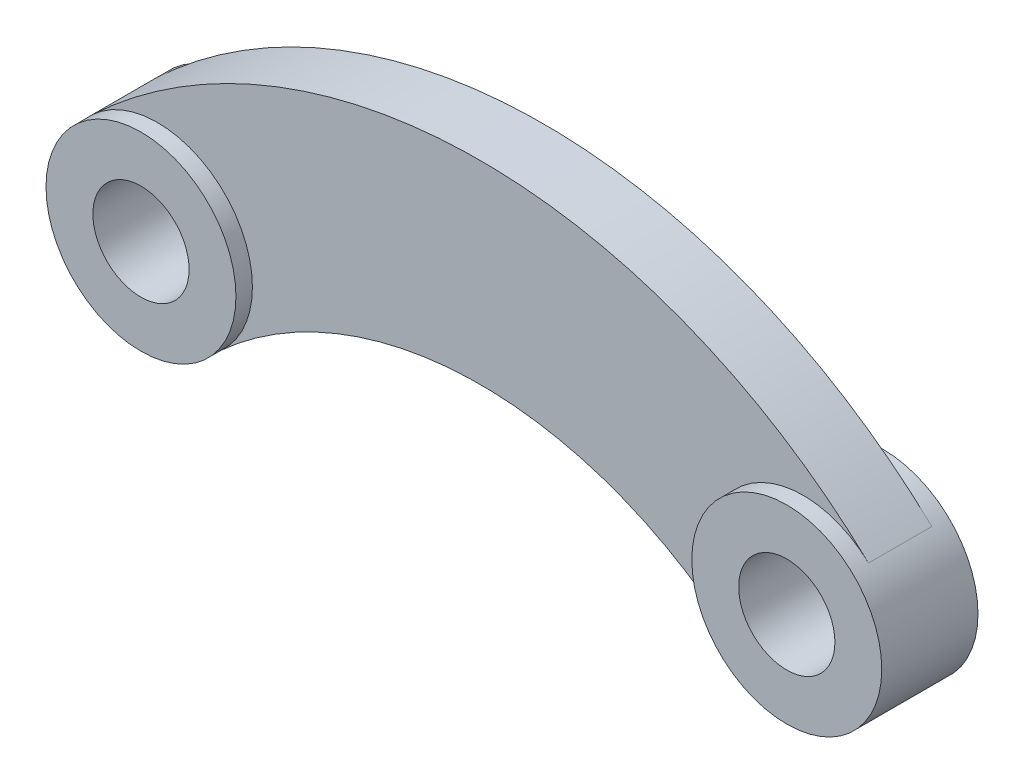
ISO-10303-21;
HEADER;
FILE_DESCRIPTION(('STEP AP214'),'2;1');
FILE_NAME('part.step','',(''),(''),'','','');
FILE_SCHEMA(('AUTOMOTIVE_DESIGN { 1 0 10303 214 1 1 1 1 }'));
ENDSEC;
DATA;
#1=APPLICATION_CONTEXT('core data for automotive mechanical design processes');
#2=APPLICATION_PROTOCOL_DEFINITION('international standard','automotive_design',2000,#1);
#3=PRODUCT_CONTEXT('',#1,'mechanical');
#4=PRODUCT('Part','Part','',(#3));
#5=PRODUCT_RELATED_PRODUCT_CATEGORY('part','',(#4));
#6=PRODUCT_DEFINITION_FORMATION('','',#4);
#7=PRODUCT_DEFINITION_CONTEXT('part definition',#1,'design');
#8=PRODUCT_DEFINITION('design','',#6,#7);
#9=PRODUCT_DEFINITION_SHAPE('','',#8);
#10=(LENGTH_UNIT() NAMED_UNIT(*) SI_UNIT(.MILLI.,.METRE.));
#11=(NAMED_UNIT(*) PLANE_ANGLE_UNIT() SI_UNIT($,.RADIAN.));
#12=(NAMED_UNIT(*) SI_UNIT($,.STERADIAN.) SOLID_ANGLE_UNIT());
#13=UNCERTAINTY_MEASURE_WITH_UNIT(LENGTH_MEASURE(1.E-05),#10,'distance_accuracy_value','');
#14=(GEOMETRIC_REPRESENTATION_CONTEXT(3) GLOBAL_UNCERTAINTY_ASSIGNED_CONTEXT((#13)) GLOBAL_UNIT_ASSIGNED_CONTEXT((#10,
#11,#12)) REPRESENTATION_CONTEXT('',''));
#15=CARTESIAN_POINT('',(0.,0.,0.));
#16=DIRECTION('',(0.,0.,1.));
#17=DIRECTION('',(1.,0.,0.));
#18=AXIS2_PLACEMENT_3D('',#15,#16,#17);
#19=CARTESIAN_POINT('',(382.5,-140.867845869808,25.));
#20=DIRECTION('',(0.,0.,-1.));
#21=DIRECTION('',(-1.,0.,0.));
#22=AXIS2_PLACEMENT_3D('',#19,#20,#21);
#23=PLANE('',#22);
#24=CARTESIAN_POINT('',(510.,0.,25.));
#25=DIRECTION('',(0.,0.,-1.));
#26=DIRECTION('',(-1.,0.,0.));
#27=AXIS2_PLACEMENT_3D('',#24,#25,#26);
#28=CIRCLE('',#27,75.0000000000001);
#29=CARTESIAN_POINT('',(561.549865229111,54.4757872348858,25.));
#30=VERTEX_POINT('',#29);
#31=CARTESIAN_POINT('',(459.671052631579,-55.6057286328191,25.));
#32=VERTEX_POINT('',#31);
#33=EDGE_CURVE('E96',#30,#32,#28,.F.);
#34=ORIENTED_EDGE('',*,*,#33,.F.);
#35=CARTESIAN_POINT('',(255.,-269.473560855235,25.));
#36=DIRECTION('',(0.,0.,1.));
#37=DIRECTION('',(-1.,0.,0.));
#38=AXIS2_PLACEMENT_3D('',#35,#36,#37);
#39=CIRCLE('',#38,446.);
#40=CARTESIAN_POINT('',(-51.5498652291105,54.4757872348858,25.));
#41=VERTEX_POINT('',#40);
#42=EDGE_CURVE('E61',#30,#41,#39,.T.);
#43=ORIENTED_EDGE('',*,*,#42,.T.);
#44=CARTESIAN_POINT('',(0.,0.,25.));
#45=DIRECTION('',(0.,0.,-1.));
#46=DIRECTION('',(-1.,0.,0.));
#47=AXIS2_PLACEMENT_3D('',#44,#45,#46);
#48=CIRCLE('',#47,75.0000000000001);
#49=CARTESIAN_POINT('',(50.3289473684211,-55.605728632819,25.));
#50=VERTEX_POINT('',#49);
#51=EDGE_CURVE('E114',#50,#41,#48,.F.);
#52=ORIENTED_EDGE('',*,*,#51,.F.);
#53=CARTESIAN_POINT('',(255.,-281.735691739616,25.));
#54=DIRECTION('',(0.,0.,-1.));
#55=DIRECTION('',(-1.,0.,0.));
#56=AXIS2_PLACEMENT_3D('',#53,#54,#55);
#57=CIRCLE('',#56,305.);
#58=EDGE_CURVE('E80',#50,#32,#57,.T.);
#59=ORIENTED_EDGE('',*,*,#58,.T.);
#60=EDGE_LOOP('',(#34,#43,#52,#59));
#61=FACE_BOUND('',#60,.T.);
#62=ADVANCED_FACE('F43',(#61),#23,.F.);
#63=CARTESIAN_POINT('',(382.5,-140.867845869808,-25.));
#64=DIRECTION('',(0.,0.,-1.));
#65=DIRECTION('',(-1.,0.,0.));
#66=AXIS2_PLACEMENT_3D('',#63,#64,#65);
#67=PLANE('',#66);
#68=CARTESIAN_POINT('',(255.,-269.473560855235,-25.));
#69=DIRECTION('',(0.,0.,1.));
#70=DIRECTION('',(-1.,0.,0.));
#71=AXIS2_PLACEMENT_3D('',#68,#69,#70);
#72=CIRCLE('',#71,446.);
#73=CARTESIAN_POINT('',(561.549865229111,54.4757872348858,-25.));
#74=VERTEX_POINT('',#73);
#75=CARTESIAN_POINT('',(-51.5498652291105,54.4757872348858,-25.));
#76=VERTEX_POINT('',#75);
#77=EDGE_CURVE('E102',#74,#76,#72,.T.);
#78=ORIENTED_EDGE('',*,*,#77,.F.);
#79=CARTESIAN_POINT('',(510.,0.,-25.));
#80=DIRECTION('',(0.,0.,-1.));
#81=DIRECTION('',(-1.,0.,0.));
#82=AXIS2_PLACEMENT_3D('',#79,#80,#81);
#83=CIRCLE('',#82,75.0000000000001);
#84=CARTESIAN_POINT('',(459.671052631579,-55.605728632819,-25.));
#85=VERTEX_POINT('',#84);
#86=EDGE_CURVE('E72',#74,#85,#83,.F.);
#87=ORIENTED_EDGE('',*,*,#86,.T.);
#88=CARTESIAN_POINT('',(255.,-281.735691739616,-25.));
#89=DIRECTION('',(0.,0.,-1.));
#90=DIRECTION('',(-1.,0.,0.));
#91=AXIS2_PLACEMENT_3D('',#88,#89,#90);
#92=CIRCLE('',#91,305.);
#93=CARTESIAN_POINT('',(50.3289473684211,-55.605728632819,-25.));
#94=VERTEX_POINT('',#93);
#95=EDGE_CURVE('E109',#94,#85,#92,.T.);
#96=ORIENTED_EDGE('',*,*,#95,.F.);
#97=CARTESIAN_POINT('',(0.,0.,-25.));
#98=DIRECTION('',(0.,0.,-1.));
#99=DIRECTION('',(-1.,0.,0.));
#100=AXIS2_PLACEMENT_3D('',#97,#98,#99);
#101=CIRCLE('',#100,75.0000000000001);
#102=EDGE_CURVE('E107',#94,#76,#101,.F.);
#103=ORIENTED_EDGE('',*,*,#102,.T.);
#104=EDGE_LOOP('',(#78,#87,#96,#103));
#105=FACE_BOUND('',#104,.T.);
#106=ADVANCED_FACE('F106',(#105),#67,.T.);
#107=CARTESIAN_POINT('',(255.,-281.735691739616,25.));
#108=DIRECTION('',(0.,0.,-1.));
#109=DIRECTION('',(-1.,0.,0.));
#110=AXIS2_PLACEMENT_3D('',#107,#108,#109);
#111=CYLINDRICAL_SURFACE('',#110,305.);
#112=ORIENTED_EDGE('',*,*,#95,.T.);
#113=DIRECTION('',(0.,0.,-1.));
#114=VECTOR('',#113,1.);
#115=CARTESIAN_POINT('',(459.671052631579,-55.605728632819,25.));
#116=LINE('',#115,#114);
#117=EDGE_CURVE('E11',#32,#85,#116,.T.);
#118=ORIENTED_EDGE('',*,*,#117,.F.);
#119=ORIENTED_EDGE('',*,*,#58,.F.);
#120=DIRECTION('',(0.,0.,-1.));
#121=VECTOR('',#120,1.);
#122=CARTESIAN_POINT('',(50.3289473684211,-55.605728632819,25.));
#123=LINE('',#122,#121);
#124=EDGE_CURVE('E118',#50,#94,#123,.T.);
#125=ORIENTED_EDGE('',*,*,#124,.T.);
#126=EDGE_LOOP('',(#112,#118,#119,#125));
#127=FACE_BOUND('',#126,.T.);
#128=ADVANCED_FACE('F45',(#127),#111,.F.);
#129=CARTESIAN_POINT('',(510.,0.,25.));
#130=DIRECTION('',(0.,0.,-1.));
#131=DIRECTION('',(-1.,0.,0.));
#132=AXIS2_PLACEMENT_3D('',#129,#130,#131);
#133=CYLINDRICAL_SURFACE('',#132,75.0000000000001);
#134=ORIENTED_EDGE('',*,*,#117,.T.);
#135=ORIENTED_EDGE('',*,*,#86,.F.);
#136=DIRECTION('',(0.,0.,-1.));
#137=VECTOR('',#136,1.);
#138=CARTESIAN_POINT('',(561.549865229111,54.4757872348858,25.));
#139=LINE('',#138,#137);
#140=EDGE_CURVE('E53',#30,#74,#139,.T.);
#141=ORIENTED_EDGE('',*,*,#140,.F.);
#142=ORIENTED_EDGE('',*,*,#33,.T.);
#143=EDGE_LOOP('',(#134,#135,#141,#142));
#144=FACE_BOUND('',#143,.T.);
#145=CARTESIAN_POINT('',(510.,0.,-38.));
#146=DIRECTION('',(0.,0.,1.));
#147=DIRECTION('',(1.,0.,0.));
#148=AXIS2_PLACEMENT_3D('',#145,#146,#147);
#149=CIRCLE('',#148,75.0000000000001);
#150=CARTESIAN_POINT('',(585.,0.,-38.));
#151=VERTEX_POINT('',#150);
#152=EDGE_CURVE('E154',#151,#151,#149,.T.);
#153=ORIENTED_EDGE('',*,*,#152,.T.);
#154=EDGE_LOOP('',(#153));
#155=FACE_BOUND('',#154,.T.);
#156=CARTESIAN_POINT('',(510.,0.,38.));
#157=DIRECTION('',(0.,0.,1.));
#158=DIRECTION('',(1.,0.,0.));
#159=AXIS2_PLACEMENT_3D('',#156,#157,#158);
#160=CIRCLE('',#159,75.0000000000001);
#161=CARTESIAN_POINT('',(585.,0.,38.));
#162=VERTEX_POINT('',#161);
#163=EDGE_CURVE('E158',#162,#162,#160,.T.);
#164=ORIENTED_EDGE('',*,*,#163,.F.);
#165=EDGE_LOOP('',(#164));
#166=FACE_BOUND('',#165,.T.);
#167=ADVANCED_FACE('F91',(#144,#155,#166),#133,.T.);
#168=CARTESIAN_POINT('',(255.,-269.473560855235,25.));
#169=DIRECTION('',(0.,0.,-1.));
#170=DIRECTION('',(-1.,0.,0.));
#171=AXIS2_PLACEMENT_3D('',#168,#169,#170);
#172=CYLINDRICAL_SURFACE('',#171,446.);
#173=ORIENTED_EDGE('',*,*,#77,.T.);
#174=DIRECTION('',(0.,0.,-1.));
#175=VECTOR('',#174,1.);
#176=CARTESIAN_POINT('',(-51.5498652291105,54.4757872348858,25.));
#177=LINE('',#176,#175);
#178=EDGE_CURVE('E105',#41,#76,#177,.T.);
#179=ORIENTED_EDGE('',*,*,#178,.F.);
#180=ORIENTED_EDGE('',*,*,#42,.F.);
#181=ORIENTED_EDGE('',*,*,#140,.T.);
#182=EDGE_LOOP('',(#173,#179,#180,#181));
#183=FACE_BOUND('',#182,.T.);
#184=ADVANCED_FACE('F101',(#183),#172,.T.);
#185=CARTESIAN_POINT('',(0.,0.,25.));
#186=DIRECTION('',(0.,0.,-1.));
#187=DIRECTION('',(-1.,0.,0.));
#188=AXIS2_PLACEMENT_3D('',#185,#186,#187);
#189=CYLINDRICAL_SURFACE('',#188,75.0000000000001);
#190=ORIENTED_EDGE('',*,*,#178,.T.);
#191=ORIENTED_EDGE('',*,*,#102,.F.);
#192=ORIENTED_EDGE('',*,*,#124,.F.);
#193=ORIENTED_EDGE('',*,*,#51,.T.);
#194=EDGE_LOOP('',(#190,#191,#192,#193));
#195=FACE_BOUND('',#194,.T.);
#196=CARTESIAN_POINT('',(0.,0.,-38.));
#197=DIRECTION('',(0.,0.,1.));
#198=DIRECTION('',(1.,0.,0.));
#199=AXIS2_PLACEMENT_3D('',#196,#197,#198);
#200=CIRCLE('',#199,75.0000000000001);
#201=CARTESIAN_POINT('',(75.0000000000001,0.,-38.));
#202=VERTEX_POINT('',#201);
#203=EDGE_CURVE('E133',#202,#202,#200,.T.);
#204=ORIENTED_EDGE('',*,*,#203,.T.);
#205=EDGE_LOOP('',(#204));
#206=FACE_BOUND('',#205,.T.);
#207=CARTESIAN_POINT('',(0.,0.,38.));
#208=DIRECTION('',(0.,0.,1.));
#209=DIRECTION('',(1.,0.,0.));
#210=AXIS2_PLACEMENT_3D('',#207,#208,#209);
#211=CIRCLE('',#210,75.0000000000001);
#212=CARTESIAN_POINT('',(75.0000000000001,0.,38.));
#213=VERTEX_POINT('',#212);
#214=EDGE_CURVE('E129',#213,#213,#211,.T.);
#215=ORIENTED_EDGE('',*,*,#214,.F.);
#216=EDGE_LOOP('',(#215));
#217=FACE_BOUND('',#216,.T.);
#218=ADVANCED_FACE('F124',(#195,#206,#217),#189,.T.);
#219=CARTESIAN_POINT('',(0.,0.,-38.));
#220=DIRECTION('',(0.,0.,1.));
#221=DIRECTION('',(1.,0.,0.));
#222=AXIS2_PLACEMENT_3D('',#219,#220,#221);
#223=PLANE('',#222);
#224=ORIENTED_EDGE('',*,*,#203,.F.);
#225=EDGE_LOOP('',(#224));
#226=FACE_BOUND('',#225,.T.);
#227=CARTESIAN_POINT('',(0.,0.,-38.));
#228=DIRECTION('',(0.,0.,1.));
#229=DIRECTION('',(1.,0.,0.));
#230=AXIS2_PLACEMENT_3D('',#227,#228,#229);
#231=CIRCLE('',#230,38.);
#232=CARTESIAN_POINT('',(38.,0.,-38.));
#233=VERTEX_POINT('',#232);
#234=EDGE_CURVE('E141',#233,#233,#231,.T.);
#235=ORIENTED_EDGE('',*,*,#234,.T.);
#236=EDGE_LOOP('',(#235));
#237=FACE_BOUND('',#236,.T.);
#238=ADVANCED_FACE('F198',(#226,#237),#223,.F.);
#239=CARTESIAN_POINT('',(0.,0.,25.));
#240=DIRECTION('',(0.,0.,-1.));
#241=DIRECTION('',(-1.,0.,0.));
#242=AXIS2_PLACEMENT_3D('',#239,#240,#241);
#243=CYLINDRICAL_SURFACE('',#242,38.);
#244=ORIENTED_EDGE('',*,*,#234,.F.);
#245=EDGE_LOOP('',(#244));
#246=FACE_BOUND('',#245,.T.);
#247=CARTESIAN_POINT('',(0.,0.,38.));
#248=DIRECTION('',(0.,0.,1.));
#249=DIRECTION('',(1.,0.,0.));
#250=AXIS2_PLACEMENT_3D('',#247,#248,#249);
#251=CIRCLE('',#250,38.);
#252=CARTESIAN_POINT('',(38.,0.,38.));
#253=VERTEX_POINT('',#252);
#254=EDGE_CURVE('E137',#253,#253,#251,.T.);
#255=ORIENTED_EDGE('',*,*,#254,.T.);
#256=EDGE_LOOP('',(#255));
#257=FACE_BOUND('',#256,.T.);
#258=ADVANCED_FACE('F194',(#246,#257),#243,.F.);
#259=CARTESIAN_POINT('',(0.,0.,38.));
#260=DIRECTION('',(0.,0.,1.));
#261=DIRECTION('',(1.,0.,0.));
#262=AXIS2_PLACEMENT_3D('',#259,#260,#261);
#263=PLANE('',#262);
#264=ORIENTED_EDGE('',*,*,#214,.T.);
#265=EDGE_LOOP('',(#264));
#266=FACE_BOUND('',#265,.T.);
#267=ORIENTED_EDGE('',*,*,#254,.F.);
#268=EDGE_LOOP('',(#267));
#269=FACE_BOUND('',#268,.T.);
#270=ADVANCED_FACE('F171',(#266,#269),#263,.T.);
#271=CARTESIAN_POINT('',(510.,0.,-38.));
#272=DIRECTION('',(0.,0.,1.));
#273=DIRECTION('',(1.,0.,0.));
#274=AXIS2_PLACEMENT_3D('',#271,#272,#273);
#275=PLANE('',#274);
#276=ORIENTED_EDGE('',*,*,#152,.F.);
#277=EDGE_LOOP('',(#276));
#278=FACE_BOUND('',#277,.T.);
#279=CARTESIAN_POINT('',(510.,0.,-38.));
#280=DIRECTION('',(0.,0.,1.));
#281=DIRECTION('',(1.,0.,0.));
#282=AXIS2_PLACEMENT_3D('',#279,#280,#281);
#283=CIRCLE('',#282,38.);
#284=CARTESIAN_POINT('',(548.,0.,-38.));
#285=VERTEX_POINT('',#284);
#286=EDGE_CURVE('E97',#285,#285,#283,.T.);
#287=ORIENTED_EDGE('',*,*,#286,.T.);
#288=EDGE_LOOP('',(#287));
#289=FACE_BOUND('',#288,.T.);
#290=ADVANCED_FACE('F167',(#278,#289),#275,.F.);
#291=CARTESIAN_POINT('',(510.,0.,25.));
#292=DIRECTION('',(0.,0.,-1.));
#293=DIRECTION('',(-1.,0.,0.));
#294=AXIS2_PLACEMENT_3D('',#291,#292,#293);
#295=CYLINDRICAL_SURFACE('',#294,38.);
#296=ORIENTED_EDGE('',*,*,#286,.F.);
#297=EDGE_LOOP('',(#296));
#298=FACE_BOUND('',#297,.T.);
#299=CARTESIAN_POINT('',(510.,0.,38.));
#300=DIRECTION('',(0.,0.,1.));
#301=DIRECTION('',(1.,0.,0.));
#302=AXIS2_PLACEMENT_3D('',#299,#300,#301);
#303=CIRCLE('',#302,38.);
#304=CARTESIAN_POINT('',(548.,0.,38.));
#305=VERTEX_POINT('',#304);
#306=EDGE_CURVE('E150',#305,#305,#303,.T.);
#307=ORIENTED_EDGE('',*,*,#306,.T.);
#308=EDGE_LOOP('',(#307));
#309=FACE_BOUND('',#308,.T.);
#310=ADVANCED_FACE('F170',(#298,#309),#295,.F.);
#311=CARTESIAN_POINT('',(510.,0.,38.));
#312=DIRECTION('',(0.,0.,1.));
#313=DIRECTION('',(1.,0.,0.));
#314=AXIS2_PLACEMENT_3D('',#311,#312,#313);
#315=PLANE('',#314);
#316=ORIENTED_EDGE('',*,*,#163,.T.);
#317=EDGE_LOOP('',(#316));
#318=FACE_BOUND('',#317,.T.);
#319=ORIENTED_EDGE('',*,*,#306,.F.);
#320=EDGE_LOOP('',(#319));
#321=FACE_BOUND('',#320,.T.);
#322=ADVANCED_FACE('F177',(#318,#321),#315,.T.);
#323=CLOSED_SHELL('',(#62,#106,#128,#167,#184,#218,#238,#258,#270,#290,#310,#322));
#324=MANIFOLD_SOLID_BREP('B2',#323);
#325=ADVANCED_BREP_SHAPE_REPRESENTATION('',(#18,#324),#14);
#326=SHAPE_DEFINITION_REPRESENTATION(#9,#325);
ENDSEC;
END-ISO-10303-21;
